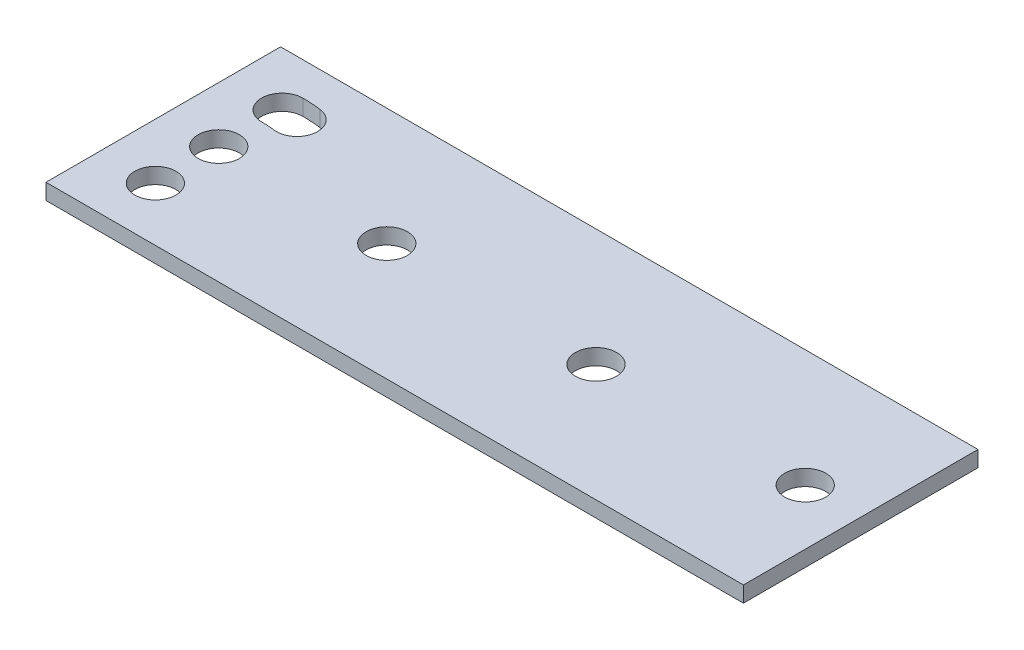
ISO-10303-21;
HEADER;
FILE_DESCRIPTION(('STEP AP214'),'2;1');
FILE_NAME('part.step','',(''),(''),'','','');
FILE_SCHEMA(('AUTOMOTIVE_DESIGN { 1 0 10303 214 1 1 1 1 }'));
ENDSEC;
DATA;
#1=APPLICATION_CONTEXT('core data for automotive mechanical design processes');
#2=APPLICATION_PROTOCOL_DEFINITION('international standard','automotive_design',2000,#1);
#3=PRODUCT_CONTEXT('',#1,'mechanical');
#4=PRODUCT('Part','Part','',(#3));
#5=PRODUCT_RELATED_PRODUCT_CATEGORY('part','',(#4));
#6=PRODUCT_DEFINITION_FORMATION('','',#4);
#7=PRODUCT_DEFINITION_CONTEXT('part definition',#1,'design');
#8=PRODUCT_DEFINITION('design','',#6,#7);
#9=PRODUCT_DEFINITION_SHAPE('','',#8);
#10=(LENGTH_UNIT() NAMED_UNIT(*) SI_UNIT(.MILLI.,.METRE.));
#11=(NAMED_UNIT(*) PLANE_ANGLE_UNIT() SI_UNIT($,.RADIAN.));
#12=(NAMED_UNIT(*) SI_UNIT($,.STERADIAN.) SOLID_ANGLE_UNIT());
#13=UNCERTAINTY_MEASURE_WITH_UNIT(LENGTH_MEASURE(1.E-05),#10,'distance_accuracy_value','');
#14=(GEOMETRIC_REPRESENTATION_CONTEXT(3) GLOBAL_UNCERTAINTY_ASSIGNED_CONTEXT((#13)) GLOBAL_UNIT_ASSIGNED_CONTEXT((#10,
#11,#12)) REPRESENTATION_CONTEXT('',''));
#15=CARTESIAN_POINT('',(0.,0.,0.));
#16=DIRECTION('',(0.,0.,1.));
#17=DIRECTION('',(1.,0.,0.));
#18=AXIS2_PLACEMENT_3D('',#15,#16,#17);
#19=CARTESIAN_POINT('',(0.,5.,0.));
#20=DIRECTION('',(0.,-1.,0.));
#21=DIRECTION('',(0.,0.,-1.));
#22=AXIS2_PLACEMENT_3D('',#19,#20,#21);
#23=PLANE('',#22);
#24=CARTESIAN_POINT('',(17.5,5.,-17.));
#25=DIRECTION('',(0.,1.,0.));
#26=DIRECTION('',(0.,0.,1.));
#27=AXIS2_PLACEMENT_3D('',#24,#25,#26);
#28=CIRCLE('',#27,6.5);
#29=CARTESIAN_POINT('',(17.5,5.,-10.5));
#30=VERTEX_POINT('',#29);
#31=EDGE_CURVE('E153',#30,#30,#28,.T.);
#32=ORIENTED_EDGE('',*,*,#31,.F.);
#33=EDGE_LOOP('',(#32));
#34=FACE_BOUND('',#33,.T.);
#35=CARTESIAN_POINT('',(136.5,5.,-37.));
#36=DIRECTION('',(0.,1.,0.));
#37=DIRECTION('',(0.,0.,-1.));
#38=AXIS2_PLACEMENT_3D('',#35,#36,#37);
#39=CIRCLE('',#38,6.49999999999996);
#40=CARTESIAN_POINT('',(136.5,5.,-43.5));
#41=VERTEX_POINT('',#40);
#42=EDGE_CURVE('E161',#41,#41,#39,.T.);
#43=ORIENTED_EDGE('',*,*,#42,.F.);
#44=EDGE_LOOP('',(#43));
#45=FACE_BOUND('',#44,.T.);
#46=CARTESIAN_POINT('',(202.5,5.,-37.));
#47=DIRECTION('',(0.,1.,0.));
#48=DIRECTION('',(0.,0.,-1.));
#49=AXIS2_PLACEMENT_3D('',#46,#47,#48);
#50=CIRCLE('',#49,6.49999999999999);
#51=CARTESIAN_POINT('',(202.5,5.,-43.5));
#52=VERTEX_POINT('',#51);
#53=EDGE_CURVE('E169',#52,#52,#50,.T.);
#54=ORIENTED_EDGE('',*,*,#53,.F.);
#55=EDGE_LOOP('',(#54));
#56=FACE_BOUND('',#55,.T.);
#57=CARTESIAN_POINT('',(70.5,5.,-37.));
#58=DIRECTION('',(0.,1.,0.));
#59=DIRECTION('',(0.,0.,1.));
#60=AXIS2_PLACEMENT_3D('',#57,#58,#59);
#61=CIRCLE('',#60,6.49999999999996);
#62=CARTESIAN_POINT('',(70.5,5.,-30.5));
#63=VERTEX_POINT('',#62);
#64=EDGE_CURVE('E177',#63,#63,#61,.T.);
#65=ORIENTED_EDGE('',*,*,#64,.F.);
#66=EDGE_LOOP('',(#65));
#67=FACE_BOUND('',#66,.T.);
#68=CARTESIAN_POINT('',(17.5,5.,-37.));
#69=DIRECTION('',(0.,1.,0.));
#70=DIRECTION('',(0.,0.,1.));
#71=AXIS2_PLACEMENT_3D('',#68,#69,#70);
#72=CIRCLE('',#71,6.5);
#73=CARTESIAN_POINT('',(17.5,5.,-30.5));
#74=VERTEX_POINT('',#73);
#75=EDGE_CURVE('E185',#74,#74,#72,.T.);
#76=ORIENTED_EDGE('',*,*,#75,.F.);
#77=EDGE_LOOP('',(#76));
#78=FACE_BOUND('',#77,.T.);
#79=DIRECTION('',(0.,0.,1.));
#80=VECTOR('',#79,1.);
#81=CARTESIAN_POINT('',(0.,5.,0.));
#82=LINE('',#81,#80);
#83=CARTESIAN_POINT('',(0.,5.,-74.));
#84=VERTEX_POINT('',#83);
#85=CARTESIAN_POINT('',(0.,5.,0.));
#86=VERTEX_POINT('',#85);
#87=EDGE_CURVE('E193',#84,#86,#82,.T.);
#88=ORIENTED_EDGE('',*,*,#87,.T.);
#89=DIRECTION('',(1.,0.,0.));
#90=VECTOR('',#89,1.);
#91=CARTESIAN_POINT('',(0.,5.,0.));
#92=LINE('',#91,#90);
#93=CARTESIAN_POINT('',(220.,5.,0.));
#94=VERTEX_POINT('',#93);
#95=EDGE_CURVE('E197',#86,#94,#92,.T.);
#96=ORIENTED_EDGE('',*,*,#95,.T.);
#97=DIRECTION('',(0.,0.,-1.));
#98=VECTOR('',#97,1.);
#99=CARTESIAN_POINT('',(220.,5.,0.));
#100=LINE('',#99,#98);
#101=CARTESIAN_POINT('',(220.,5.,-74.));
#102=VERTEX_POINT('',#101);
#103=EDGE_CURVE('E201',#94,#102,#100,.T.);
#104=ORIENTED_EDGE('',*,*,#103,.T.);
#105=DIRECTION('',(-1.,0.,0.));
#106=VECTOR('',#105,1.);
#107=CARTESIAN_POINT('',(0.,5.,-74.));
#108=LINE('',#107,#106);
#109=EDGE_CURVE('E204',#102,#84,#108,.T.);
#110=ORIENTED_EDGE('',*,*,#109,.T.);
#111=EDGE_LOOP('',(#88,#96,#104,#110));
#112=FACE_BOUND('',#111,.T.);
#113=CARTESIAN_POINT('',(17.5,5.,-17.));
#114=DIRECTION('',(0.,1.,0.));
#115=DIRECTION('',(0.,0.,1.));
#116=AXIS2_PLACEMENT_3D('',#113,#114,#115);
#117=CIRCLE('',#116,46.5);
#118=CARTESIAN_POINT('',(23.3125,5.,-63.1352884866888));
#119=VERTEX_POINT('',#118);
#120=CARTESIAN_POINT('',(17.5,5.,-63.5));
#121=VERTEX_POINT('',#120);
#122=EDGE_CURVE('E105',#119,#121,#117,.T.);
#123=ORIENTED_EDGE('',*,*,#122,.F.);
#124=CARTESIAN_POINT('',(22.5,5.,-56.6862696659689));
#125=DIRECTION('',(0.,1.,0.));
#126=DIRECTION('',(0.,0.,1.));
#127=AXIS2_PLACEMENT_3D('',#124,#125,#126);
#128=CIRCLE('',#127,6.5);
#129=CARTESIAN_POINT('',(21.6875,5.,-50.2372508452489));
#130=VERTEX_POINT('',#129);
#131=EDGE_CURVE('E131',#130,#119,#128,.T.);
#132=ORIENTED_EDGE('',*,*,#131,.F.);
#133=CARTESIAN_POINT('',(17.5,5.,-17.));
#134=DIRECTION('',(0.,-1.,0.));
#135=DIRECTION('',(0.,0.,1.));
#136=AXIS2_PLACEMENT_3D('',#133,#134,#135);
#137=CIRCLE('',#136,33.5);
#138=CARTESIAN_POINT('',(17.5,5.,-50.5));
#139=VERTEX_POINT('',#138);
#140=EDGE_CURVE('E127',#139,#130,#137,.T.);
#141=ORIENTED_EDGE('',*,*,#140,.F.);
#142=CARTESIAN_POINT('',(17.5,5.,-57.));
#143=DIRECTION('',(0.,1.,0.));
#144=DIRECTION('',(0.,0.,1.));
#145=AXIS2_PLACEMENT_3D('',#142,#143,#144);
#146=CIRCLE('',#145,6.5);
#147=EDGE_CURVE('E114',#121,#139,#146,.T.);
#148=ORIENTED_EDGE('',*,*,#147,.F.);
#149=EDGE_LOOP('',(#123,#132,#141,#148));
#150=FACE_BOUND('',#149,.T.);
#151=ADVANCED_FACE('F39',(#34,#45,#56,#67,#78,#112,#150),#23,.F.);
#152=CARTESIAN_POINT('',(0.,0.,0.));
#153=DIRECTION('',(0.,-1.,0.));
#154=DIRECTION('',(0.,0.,-1.));
#155=AXIS2_PLACEMENT_3D('',#152,#153,#154);
#156=PLANE('',#155);
#157=CARTESIAN_POINT('',(136.5,0.,-37.));
#158=DIRECTION('',(0.,1.,0.));
#159=DIRECTION('',(0.,0.,-1.));
#160=AXIS2_PLACEMENT_3D('',#157,#158,#159);
#161=CIRCLE('',#160,6.49999999999996);
#162=CARTESIAN_POINT('',(136.5,0.,-43.5));
#163=VERTEX_POINT('',#162);
#164=EDGE_CURVE('E157',#163,#163,#161,.T.);
#165=ORIENTED_EDGE('',*,*,#164,.T.);
#166=EDGE_LOOP('',(#165));
#167=FACE_BOUND('',#166,.T.);
#168=CARTESIAN_POINT('',(70.5,0.,-37.));
#169=DIRECTION('',(0.,1.,0.));
#170=DIRECTION('',(0.,0.,1.));
#171=AXIS2_PLACEMENT_3D('',#168,#169,#170);
#172=CIRCLE('',#171,6.49999999999996);
#173=CARTESIAN_POINT('',(70.5,0.,-30.5));
#174=VERTEX_POINT('',#173);
#175=EDGE_CURVE('E173',#174,#174,#172,.T.);
#176=ORIENTED_EDGE('',*,*,#175,.T.);
#177=EDGE_LOOP('',(#176));
#178=FACE_BOUND('',#177,.T.);
#179=DIRECTION('',(0.,0.,1.));
#180=VECTOR('',#179,1.);
#181=CARTESIAN_POINT('',(0.,0.,0.));
#182=LINE('',#181,#180);
#183=CARTESIAN_POINT('',(0.,0.,-74.));
#184=VERTEX_POINT('',#183);
#185=CARTESIAN_POINT('',(0.,0.,0.));
#186=VERTEX_POINT('',#185);
#187=EDGE_CURVE('E189',#184,#186,#182,.T.);
#188=ORIENTED_EDGE('',*,*,#187,.F.);
#189=DIRECTION('',(-1.,0.,0.));
#190=VECTOR('',#189,1.);
#191=CARTESIAN_POINT('',(0.,0.,-74.));
#192=LINE('',#191,#190);
#193=CARTESIAN_POINT('',(220.,0.,-74.));
#194=VERTEX_POINT('',#193);
#195=EDGE_CURVE('E198',#194,#184,#192,.T.);
#196=ORIENTED_EDGE('',*,*,#195,.F.);
#197=DIRECTION('',(0.,0.,-1.));
#198=VECTOR('',#197,1.);
#199=CARTESIAN_POINT('',(220.,0.,0.));
#200=LINE('',#199,#198);
#201=CARTESIAN_POINT('',(220.,0.,0.));
#202=VERTEX_POINT('',#201);
#203=EDGE_CURVE('E214',#202,#194,#200,.T.);
#204=ORIENTED_EDGE('',*,*,#203,.F.);
#205=DIRECTION('',(1.,0.,0.));
#206=VECTOR('',#205,1.);
#207=CARTESIAN_POINT('',(0.,0.,0.));
#208=LINE('',#207,#206);
#209=EDGE_CURVE('E211',#186,#202,#208,.T.);
#210=ORIENTED_EDGE('',*,*,#209,.F.);
#211=EDGE_LOOP('',(#188,#196,#204,#210));
#212=FACE_BOUND('',#211,.T.);
#213=CARTESIAN_POINT('',(17.5,0.,-37.));
#214=DIRECTION('',(0.,1.,0.));
#215=DIRECTION('',(0.,0.,1.));
#216=AXIS2_PLACEMENT_3D('',#213,#214,#215);
#217=CIRCLE('',#216,6.5);
#218=CARTESIAN_POINT('',(17.5,0.,-30.5));
#219=VERTEX_POINT('',#218);
#220=EDGE_CURVE('E181',#219,#219,#217,.T.);
#221=ORIENTED_EDGE('',*,*,#220,.T.);
#222=EDGE_LOOP('',(#221));
#223=FACE_BOUND('',#222,.T.);
#224=CARTESIAN_POINT('',(202.5,0.,-37.));
#225=DIRECTION('',(0.,1.,0.));
#226=DIRECTION('',(0.,0.,-1.));
#227=AXIS2_PLACEMENT_3D('',#224,#225,#226);
#228=CIRCLE('',#227,6.49999999999999);
#229=CARTESIAN_POINT('',(202.5,0.,-43.5));
#230=VERTEX_POINT('',#229);
#231=EDGE_CURVE('E165',#230,#230,#228,.T.);
#232=ORIENTED_EDGE('',*,*,#231,.T.);
#233=EDGE_LOOP('',(#232));
#234=FACE_BOUND('',#233,.T.);
#235=CARTESIAN_POINT('',(17.5,0.,-17.));
#236=DIRECTION('',(0.,1.,0.));
#237=DIRECTION('',(0.,0.,1.));
#238=AXIS2_PLACEMENT_3D('',#235,#236,#237);
#239=CIRCLE('',#238,6.5);
#240=CARTESIAN_POINT('',(17.5,0.,-10.5));
#241=VERTEX_POINT('',#240);
#242=EDGE_CURVE('E123',#241,#241,#239,.T.);
#243=ORIENTED_EDGE('',*,*,#242,.T.);
#244=EDGE_LOOP('',(#243));
#245=FACE_BOUND('',#244,.T.);
#246=CARTESIAN_POINT('',(22.5,0.,-56.6862696659689));
#247=DIRECTION('',(0.,1.,0.));
#248=DIRECTION('',(0.,0.,1.));
#249=AXIS2_PLACEMENT_3D('',#246,#247,#248);
#250=CIRCLE('',#249,6.5);
#251=CARTESIAN_POINT('',(21.6875,0.,-50.2372508452489));
#252=VERTEX_POINT('',#251);
#253=CARTESIAN_POINT('',(23.3125,0.,-63.1352884866888));
#254=VERTEX_POINT('',#253);
#255=EDGE_CURVE('E115',#252,#254,#250,.T.);
#256=ORIENTED_EDGE('',*,*,#255,.T.);
#257=CARTESIAN_POINT('',(17.5,0.,-17.));
#258=DIRECTION('',(0.,1.,0.));
#259=DIRECTION('',(0.,0.,1.));
#260=AXIS2_PLACEMENT_3D('',#257,#258,#259);
#261=CIRCLE('',#260,46.5);
#262=CARTESIAN_POINT('',(17.5,0.,-63.5));
#263=VERTEX_POINT('',#262);
#264=EDGE_CURVE('E63',#254,#263,#261,.T.);
#265=ORIENTED_EDGE('',*,*,#264,.T.);
#266=CARTESIAN_POINT('',(17.5,0.,-57.));
#267=DIRECTION('',(0.,1.,0.));
#268=DIRECTION('',(0.,0.,1.));
#269=AXIS2_PLACEMENT_3D('',#266,#267,#268);
#270=CIRCLE('',#269,6.5);
#271=CARTESIAN_POINT('',(17.5,0.,-50.5));
#272=VERTEX_POINT('',#271);
#273=EDGE_CURVE('E121',#263,#272,#270,.T.);
#274=ORIENTED_EDGE('',*,*,#273,.T.);
#275=CARTESIAN_POINT('',(17.5,0.,-17.));
#276=DIRECTION('',(0.,-1.,0.));
#277=DIRECTION('',(0.,0.,1.));
#278=AXIS2_PLACEMENT_3D('',#275,#276,#277);
#279=CIRCLE('',#278,33.5);
#280=EDGE_CURVE('E140',#272,#252,#279,.T.);
#281=ORIENTED_EDGE('',*,*,#280,.T.);
#282=EDGE_LOOP('',(#256,#265,#274,#281));
#283=FACE_BOUND('',#282,.T.);
#284=ADVANCED_FACE('F237',(#167,#178,#212,#223,#234,#245,#283),#156,.T.);
#285=CARTESIAN_POINT('',(0.,5.,0.));
#286=DIRECTION('',(1.,0.,0.));
#287=DIRECTION('',(0.,0.,-1.));
#288=AXIS2_PLACEMENT_3D('',#285,#286,#287);
#289=PLANE('',#288);
#290=ORIENTED_EDGE('',*,*,#187,.T.);
#291=DIRECTION('',(0.,-1.,0.));
#292=VECTOR('',#291,1.);
#293=CARTESIAN_POINT('',(0.,5.,0.));
#294=LINE('',#293,#292);
#295=EDGE_CURVE('E11',#86,#186,#294,.T.);
#296=ORIENTED_EDGE('',*,*,#295,.F.);
#297=ORIENTED_EDGE('',*,*,#87,.F.);
#298=DIRECTION('',(0.,-1.,0.));
#299=VECTOR('',#298,1.);
#300=CARTESIAN_POINT('',(0.,5.,-74.));
#301=LINE('',#300,#299);
#302=EDGE_CURVE('E207',#84,#184,#301,.T.);
#303=ORIENTED_EDGE('',*,*,#302,.T.);
#304=EDGE_LOOP('',(#290,#296,#297,#303));
#305=FACE_BOUND('',#304,.T.);
#306=ADVANCED_FACE('F41',(#305),#289,.F.);
#307=CARTESIAN_POINT('',(0.,5.,0.));
#308=DIRECTION('',(0.,0.,-1.));
#309=DIRECTION('',(-1.,0.,0.));
#310=AXIS2_PLACEMENT_3D('',#307,#308,#309);
#311=PLANE('',#310);
#312=ORIENTED_EDGE('',*,*,#209,.T.);
#313=DIRECTION('',(0.,-1.,0.));
#314=VECTOR('',#313,1.);
#315=CARTESIAN_POINT('',(220.,5.,0.));
#316=LINE('',#315,#314);
#317=EDGE_CURVE('E48',#94,#202,#316,.T.);
#318=ORIENTED_EDGE('',*,*,#317,.F.);
#319=ORIENTED_EDGE('',*,*,#95,.F.);
#320=ORIENTED_EDGE('',*,*,#295,.T.);
#321=EDGE_LOOP('',(#312,#318,#319,#320));
#322=FACE_BOUND('',#321,.T.);
#323=ADVANCED_FACE('F247',(#322),#311,.F.);
#324=CARTESIAN_POINT('',(220.,5.,0.));
#325=DIRECTION('',(-1.,0.,0.));
#326=DIRECTION('',(0.,0.,1.));
#327=AXIS2_PLACEMENT_3D('',#324,#325,#326);
#328=PLANE('',#327);
#329=ORIENTED_EDGE('',*,*,#203,.T.);
#330=DIRECTION('',(0.,-1.,0.));
#331=VECTOR('',#330,1.);
#332=CARTESIAN_POINT('',(220.,5.,-74.));
#333=LINE('',#332,#331);
#334=EDGE_CURVE('E222',#102,#194,#333,.T.);
#335=ORIENTED_EDGE('',*,*,#334,.F.);
#336=ORIENTED_EDGE('',*,*,#103,.F.);
#337=ORIENTED_EDGE('',*,*,#317,.T.);
#338=EDGE_LOOP('',(#329,#335,#336,#337));
#339=FACE_BOUND('',#338,.T.);
#340=ADVANCED_FACE('F231',(#339),#328,.F.);
#341=CARTESIAN_POINT('',(0.,5.,-74.));
#342=DIRECTION('',(0.,0.,1.));
#343=DIRECTION('',(1.,0.,0.));
#344=AXIS2_PLACEMENT_3D('',#341,#342,#343);
#345=PLANE('',#344);
#346=ORIENTED_EDGE('',*,*,#195,.T.);
#347=ORIENTED_EDGE('',*,*,#302,.F.);
#348=ORIENTED_EDGE('',*,*,#109,.F.);
#349=ORIENTED_EDGE('',*,*,#334,.T.);
#350=EDGE_LOOP('',(#346,#347,#348,#349));
#351=FACE_BOUND('',#350,.T.);
#352=ADVANCED_FACE('F241',(#351),#345,.F.);
#353=CARTESIAN_POINT('',(17.5,5.,-37.));
#354=DIRECTION('',(0.,-1.,0.));
#355=DIRECTION('',(0.,0.,-1.));
#356=AXIS2_PLACEMENT_3D('',#353,#354,#355);
#357=CYLINDRICAL_SURFACE('',#356,6.5);
#358=ORIENTED_EDGE('',*,*,#75,.T.);
#359=EDGE_LOOP('',(#358));
#360=FACE_BOUND('',#359,.T.);
#361=ORIENTED_EDGE('',*,*,#220,.F.);
#362=EDGE_LOOP('',(#361));
#363=FACE_BOUND('',#362,.T.);
#364=ADVANCED_FACE('F265',(#360,#363),#357,.F.);
#365=CARTESIAN_POINT('',(70.5,5.,-37.));
#366=DIRECTION('',(0.,-1.,0.));
#367=DIRECTION('',(0.,0.,-1.));
#368=AXIS2_PLACEMENT_3D('',#365,#366,#367);
#369=CYLINDRICAL_SURFACE('',#368,6.49999999999996);
#370=ORIENTED_EDGE('',*,*,#64,.T.);
#371=EDGE_LOOP('',(#370));
#372=FACE_BOUND('',#371,.T.);
#373=ORIENTED_EDGE('',*,*,#175,.F.);
#374=EDGE_LOOP('',(#373));
#375=FACE_BOUND('',#374,.T.);
#376=ADVANCED_FACE('F272',(#372,#375),#369,.F.);
#377=CARTESIAN_POINT('',(202.5,5.,-37.));
#378=DIRECTION('',(0.,-1.,0.));
#379=DIRECTION('',(0.,0.,-1.));
#380=AXIS2_PLACEMENT_3D('',#377,#378,#379);
#381=CYLINDRICAL_SURFACE('',#380,6.49999999999999);
#382=ORIENTED_EDGE('',*,*,#53,.T.);
#383=EDGE_LOOP('',(#382));
#384=FACE_BOUND('',#383,.T.);
#385=ORIENTED_EDGE('',*,*,#231,.F.);
#386=EDGE_LOOP('',(#385));
#387=FACE_BOUND('',#386,.T.);
#388=ADVANCED_FACE('F277',(#384,#387),#381,.F.);
#389=CARTESIAN_POINT('',(136.5,5.,-37.));
#390=DIRECTION('',(0.,-1.,0.));
#391=DIRECTION('',(0.,0.,-1.));
#392=AXIS2_PLACEMENT_3D('',#389,#390,#391);
#393=CYLINDRICAL_SURFACE('',#392,6.49999999999996);
#394=ORIENTED_EDGE('',*,*,#42,.T.);
#395=EDGE_LOOP('',(#394));
#396=FACE_BOUND('',#395,.T.);
#397=ORIENTED_EDGE('',*,*,#164,.F.);
#398=EDGE_LOOP('',(#397));
#399=FACE_BOUND('',#398,.T.);
#400=ADVANCED_FACE('F305',(#396,#399),#393,.F.);
#401=CARTESIAN_POINT('',(17.5,5.,-17.));
#402=DIRECTION('',(0.,-1.,0.));
#403=DIRECTION('',(0.,0.,-1.));
#404=AXIS2_PLACEMENT_3D('',#401,#402,#403);
#405=CYLINDRICAL_SURFACE('',#404,6.5);
#406=ORIENTED_EDGE('',*,*,#31,.T.);
#407=EDGE_LOOP('',(#406));
#408=FACE_BOUND('',#407,.T.);
#409=ORIENTED_EDGE('',*,*,#242,.F.);
#410=EDGE_LOOP('',(#409));
#411=FACE_BOUND('',#410,.T.);
#412=ADVANCED_FACE('F302',(#408,#411),#405,.F.);
#413=CARTESIAN_POINT('',(17.5,5.,-17.));
#414=DIRECTION('',(0.,-1.,0.));
#415=DIRECTION('',(0.,0.,-1.));
#416=AXIS2_PLACEMENT_3D('',#413,#414,#415);
#417=CYLINDRICAL_SURFACE('',#416,46.5);
#418=ORIENTED_EDGE('',*,*,#264,.F.);
#419=DIRECTION('',(0.,-1.,0.));
#420=VECTOR('',#419,1.);
#421=CARTESIAN_POINT('',(23.3125,5.,-63.1352884866888));
#422=LINE('',#421,#420);
#423=EDGE_CURVE('E109',#119,#254,#422,.T.);
#424=ORIENTED_EDGE('',*,*,#423,.F.);
#425=ORIENTED_EDGE('',*,*,#122,.T.);
#426=DIRECTION('',(0.,-1.,0.));
#427=VECTOR('',#426,1.);
#428=CARTESIAN_POINT('',(17.5,5.,-63.5));
#429=LINE('',#428,#427);
#430=EDGE_CURVE('E108',#121,#263,#429,.T.);
#431=ORIENTED_EDGE('',*,*,#430,.T.);
#432=EDGE_LOOP('',(#418,#424,#425,#431));
#433=FACE_BOUND('',#432,.T.);
#434=ADVANCED_FACE('F107',(#433),#417,.F.);
#435=CARTESIAN_POINT('',(17.5,5.,-57.));
#436=DIRECTION('',(0.,-1.,0.));
#437=DIRECTION('',(0.,0.,-1.));
#438=AXIS2_PLACEMENT_3D('',#435,#436,#437);
#439=CYLINDRICAL_SURFACE('',#438,6.5);
#440=ORIENTED_EDGE('',*,*,#273,.F.);
#441=ORIENTED_EDGE('',*,*,#430,.F.);
#442=ORIENTED_EDGE('',*,*,#147,.T.);
#443=DIRECTION('',(0.,-1.,0.));
#444=VECTOR('',#443,1.);
#445=CARTESIAN_POINT('',(17.5,5.,-50.5));
#446=LINE('',#445,#444);
#447=EDGE_CURVE('E124',#139,#272,#446,.T.);
#448=ORIENTED_EDGE('',*,*,#447,.T.);
#449=EDGE_LOOP('',(#440,#441,#442,#448));
#450=FACE_BOUND('',#449,.T.);
#451=ADVANCED_FACE('F118',(#450),#439,.F.);
#452=CARTESIAN_POINT('',(17.5,5.,-17.));
#453=DIRECTION('',(0.,-1.,0.));
#454=DIRECTION('',(0.,0.,-1.));
#455=AXIS2_PLACEMENT_3D('',#452,#453,#454);
#456=CYLINDRICAL_SURFACE('',#455,33.5);
#457=ORIENTED_EDGE('',*,*,#280,.F.);
#458=ORIENTED_EDGE('',*,*,#447,.F.);
#459=ORIENTED_EDGE('',*,*,#140,.T.);
#460=DIRECTION('',(0.,-1.,0.));
#461=VECTOR('',#460,1.);
#462=CARTESIAN_POINT('',(21.6875,5.,-50.2372508452489));
#463=LINE('',#462,#461);
#464=EDGE_CURVE('E55',#130,#252,#463,.T.);
#465=ORIENTED_EDGE('',*,*,#464,.T.);
#466=EDGE_LOOP('',(#457,#458,#459,#465));
#467=FACE_BOUND('',#466,.T.);
#468=ADVANCED_FACE('F290',(#467),#456,.T.);
#469=CARTESIAN_POINT('',(22.5,5.,-56.6862696659689));
#470=DIRECTION('',(0.,-1.,0.));
#471=DIRECTION('',(0.,0.,-1.));
#472=AXIS2_PLACEMENT_3D('',#469,#470,#471);
#473=CYLINDRICAL_SURFACE('',#472,6.5);
#474=ORIENTED_EDGE('',*,*,#255,.F.);
#475=ORIENTED_EDGE('',*,*,#464,.F.);
#476=ORIENTED_EDGE('',*,*,#131,.T.);
#477=ORIENTED_EDGE('',*,*,#423,.T.);
#478=EDGE_LOOP('',(#474,#475,#476,#477));
#479=FACE_BOUND('',#478,.T.);
#480=ADVANCED_FACE('F288',(#479),#473,.F.);
#481=CLOSED_SHELL('',(#151,#284,#306,#323,#340,#352,#364,#376,#388,#400,#412,#434,#451,#468,#480));
#482=MANIFOLD_SOLID_BREP('B2',#481);
#483=ADVANCED_BREP_SHAPE_REPRESENTATION('',(#18,#482),#14);
#484=SHAPE_DEFINITION_REPRESENTATION(#9,#483);
ENDSEC;
END-ISO-10303-21;
